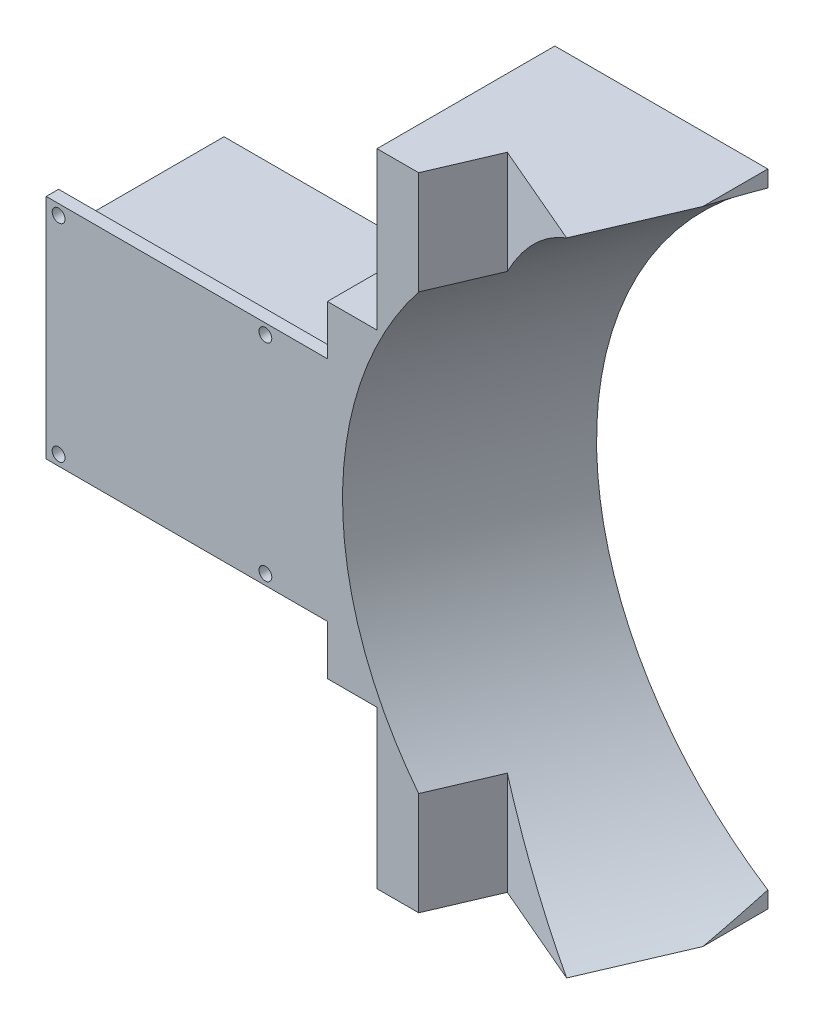
ISO-10303-21;
HEADER;
FILE_DESCRIPTION(('STEP AP214'),'2;1');
FILE_NAME('part.step','',(''),(''),'','','');
FILE_SCHEMA(('AUTOMOTIVE_DESIGN { 1 0 10303 214 1 1 1 1 }'));
ENDSEC;
DATA;
#1=APPLICATION_CONTEXT('core data for automotive mechanical design processes');
#2=APPLICATION_PROTOCOL_DEFINITION('international standard','automotive_design',2000,#1);
#3=PRODUCT_CONTEXT('',#1,'mechanical');
#4=PRODUCT('Part','Part','',(#3));
#5=PRODUCT_RELATED_PRODUCT_CATEGORY('part','',(#4));
#6=PRODUCT_DEFINITION_FORMATION('','',#4);
#7=PRODUCT_DEFINITION_CONTEXT('part definition',#1,'design');
#8=PRODUCT_DEFINITION('design','',#6,#7);
#9=PRODUCT_DEFINITION_SHAPE('','',#8);
#10=(LENGTH_UNIT() NAMED_UNIT(*) SI_UNIT(.MILLI.,.METRE.));
#11=(NAMED_UNIT(*) PLANE_ANGLE_UNIT() SI_UNIT($,.RADIAN.));
#12=(NAMED_UNIT(*) SI_UNIT($,.STERADIAN.) SOLID_ANGLE_UNIT());
#13=UNCERTAINTY_MEASURE_WITH_UNIT(LENGTH_MEASURE(1.E-05),#10,'distance_accuracy_value','');
#14=(GEOMETRIC_REPRESENTATION_CONTEXT(3) GLOBAL_UNCERTAINTY_ASSIGNED_CONTEXT((#13)) GLOBAL_UNIT_ASSIGNED_CONTEXT((#10,
#11,#12)) REPRESENTATION_CONTEXT('',''));
#15=CARTESIAN_POINT('',(0.,0.,0.));
#16=DIRECTION('',(0.,0.,1.));
#17=DIRECTION('',(1.,0.,0.));
#18=AXIS2_PLACEMENT_3D('',#15,#16,#17);
#19=CARTESIAN_POINT('',(0.,0.,0.));
#20=DIRECTION('',(0.,0.,1.));
#21=DIRECTION('',(1.,0.,0.));
#22=AXIS2_PLACEMENT_3D('',#19,#20,#21);
#23=PLANE('',#22);
#24=CARTESIAN_POINT('',(13.,25.,0.));
#25=DIRECTION('',(0.,0.,-1.));
#26=DIRECTION('',(-1.,0.,0.));
#27=AXIS2_PLACEMENT_3D('',#24,#25,#26);
#28=CIRCLE('',#27,1.55);
#29=CARTESIAN_POINT('',(11.45,25.,0.));
#30=VERTEX_POINT('',#29);
#31=EDGE_CURVE('E316',#30,#30,#28,.T.);
#32=ORIENTED_EDGE('',*,*,#31,.F.);
#33=EDGE_LOOP('',(#32));
#34=FACE_BOUND('',#33,.T.);
#35=CARTESIAN_POINT('',(-37.,25.,0.));
#36=DIRECTION('',(0.,0.,-1.));
#37=DIRECTION('',(-1.,0.,0.));
#38=AXIS2_PLACEMENT_3D('',#35,#36,#37);
#39=CIRCLE('',#38,1.55);
#40=CARTESIAN_POINT('',(-38.55,25.,0.));
#41=VERTEX_POINT('',#40);
#42=EDGE_CURVE('E321',#41,#41,#39,.T.);
#43=ORIENTED_EDGE('',*,*,#42,.F.);
#44=EDGE_LOOP('',(#43));
#45=FACE_BOUND('',#44,.T.);
#46=DIRECTION('',(1.,0.,0.));
#47=VECTOR('',#46,1.);
#48=CARTESIAN_POINT('',(-40.,18.5,0.));
#49=LINE('',#48,#47);
#50=CARTESIAN_POINT('',(-40.,18.5,0.));
#51=VERTEX_POINT('',#50);
#52=CARTESIAN_POINT('',(28.,18.5,0.));
#53=VERTEX_POINT('',#52);
#54=EDGE_CURVE('E60',#51,#53,#49,.T.);
#55=ORIENTED_EDGE('',*,*,#54,.F.);
#56=DIRECTION('',(0.,-1.,0.));
#57=VECTOR('',#56,1.);
#58=CARTESIAN_POINT('',(-40.,-27.5,0.));
#59=LINE('',#58,#57);
#60=CARTESIAN_POINT('',(-40.,27.5,0.));
#61=VERTEX_POINT('',#60);
#62=EDGE_CURVE('E209',#61,#51,#59,.T.);
#63=ORIENTED_EDGE('',*,*,#62,.F.);
#64=DIRECTION('',(-1.,0.,0.));
#65=VECTOR('',#64,1.);
#66=CARTESIAN_POINT('',(40.,27.5,0.));
#67=LINE('',#66,#65);
#68=CARTESIAN_POINT('',(28.,27.5,0.));
#69=VERTEX_POINT('',#68);
#70=EDGE_CURVE('E344',#69,#61,#67,.T.);
#71=ORIENTED_EDGE('',*,*,#70,.F.);
#72=DIRECTION('',(0.,1.,0.));
#73=VECTOR('',#72,1.);
#74=CARTESIAN_POINT('',(28.,27.5,0.));
#75=LINE('',#74,#73);
#76=EDGE_CURVE('E259',#53,#69,#75,.T.);
#77=ORIENTED_EDGE('',*,*,#76,.F.);
#78=EDGE_LOOP('',(#55,#63,#71,#77));
#79=FACE_BOUND('',#78,.T.);
#80=ADVANCED_FACE('F37',(#34,#45,#79),#23,.F.);
#81=CARTESIAN_POINT('',(-37.,-25.,0.));
#82=DIRECTION('',(0.,0.,-1.));
#83=DIRECTION('',(-1.,0.,0.));
#84=AXIS2_PLACEMENT_3D('',#81,#82,#83);
#85=CIRCLE('',#84,1.55);
#86=CARTESIAN_POINT('',(-38.55,-25.,0.));
#87=VERTEX_POINT('',#86);
#88=EDGE_CURVE('E317',#87,#87,#85,.T.);
#89=ORIENTED_EDGE('',*,*,#88,.F.);
#90=EDGE_LOOP('',(#89));
#91=FACE_BOUND('',#90,.T.);
#92=CARTESIAN_POINT('',(13.,-25.,0.));
#93=DIRECTION('',(0.,0.,-1.));
#94=DIRECTION('',(-1.,0.,0.));
#95=AXIS2_PLACEMENT_3D('',#92,#93,#94);
#96=CIRCLE('',#95,1.55);
#97=CARTESIAN_POINT('',(11.45,-25.,0.));
#98=VERTEX_POINT('',#97);
#99=EDGE_CURVE('E320',#98,#98,#96,.T.);
#100=ORIENTED_EDGE('',*,*,#99,.F.);
#101=EDGE_LOOP('',(#100));
#102=FACE_BOUND('',#101,.T.);
#103=DIRECTION('',(-1.,0.,0.));
#104=VECTOR('',#103,1.);
#105=CARTESIAN_POINT('',(-40.,-18.5,0.));
#106=LINE('',#105,#104);
#107=CARTESIAN_POINT('',(28.,-18.5,0.));
#108=VERTEX_POINT('',#107);
#109=CARTESIAN_POINT('',(-40.,-18.5,0.));
#110=VERTEX_POINT('',#109);
#111=EDGE_CURVE('E206',#108,#110,#106,.T.);
#112=ORIENTED_EDGE('',*,*,#111,.F.);
#113=CARTESIAN_POINT('',(28.,-27.5,0.));
#114=VERTEX_POINT('',#113);
#115=EDGE_CURVE('E260',#114,#108,#75,.T.);
#116=ORIENTED_EDGE('',*,*,#115,.F.);
#117=DIRECTION('',(1.,0.,0.));
#118=VECTOR('',#117,1.);
#119=CARTESIAN_POINT('',(40.,-27.5,0.));
#120=LINE('',#119,#118);
#121=CARTESIAN_POINT('',(-40.,-27.5,0.));
#122=VERTEX_POINT('',#121);
#123=EDGE_CURVE('E351',#122,#114,#120,.T.);
#124=ORIENTED_EDGE('',*,*,#123,.F.);
#125=EDGE_CURVE('E52',#110,#122,#59,.T.);
#126=ORIENTED_EDGE('',*,*,#125,.F.);
#127=EDGE_LOOP('',(#112,#116,#124,#126));
#128=FACE_BOUND('',#127,.T.);
#129=ADVANCED_FACE('F441',(#91,#102,#128),#23,.F.);
#130=CARTESIAN_POINT('',(28.,0.,0.));
#131=DIRECTION('',(-1.,0.,0.));
#132=DIRECTION('',(0.,0.,1.));
#133=AXIS2_PLACEMENT_3D('',#130,#131,#132);
#134=PLANE('',#133);
#135=DIRECTION('',(0.,-1.,0.));
#136=VECTOR('',#135,1.);
#137=CARTESIAN_POINT('',(28.,39.5,-40.));
#138=LINE('',#137,#136);
#139=CARTESIAN_POINT('',(28.,39.5,-40.));
#140=VERTEX_POINT('',#139);
#141=CARTESIAN_POINT('',(28.,18.5,-40.));
#142=VERTEX_POINT('',#141);
#143=EDGE_CURVE('E250',#140,#142,#138,.T.);
#144=ORIENTED_EDGE('',*,*,#143,.T.);
#145=DIRECTION('',(0.,0.,1.));
#146=VECTOR('',#145,1.);
#147=CARTESIAN_POINT('',(28.,18.5,-40.));
#148=LINE('',#147,#146);
#149=EDGE_CURVE('E193',#142,#53,#148,.T.);
#150=ORIENTED_EDGE('',*,*,#149,.T.);
#151=ORIENTED_EDGE('',*,*,#76,.T.);
#152=DIRECTION('',(0.,0.,1.));
#153=VECTOR('',#152,1.);
#154=CARTESIAN_POINT('',(28.,27.5,3.));
#155=LINE('',#154,#153);
#156=CARTESIAN_POINT('',(28.,27.5,3.));
#157=VERTEX_POINT('',#156);
#158=EDGE_CURVE('E263',#69,#157,#155,.T.);
#159=ORIENTED_EDGE('',*,*,#158,.T.);
#160=DIRECTION('',(0.,1.,0.));
#161=VECTOR('',#160,1.);
#162=CARTESIAN_POINT('',(28.,39.5,3.));
#163=LINE('',#162,#161);
#164=CARTESIAN_POINT('',(28.,39.5,3.));
#165=VERTEX_POINT('',#164);
#166=EDGE_CURVE('E265',#157,#165,#163,.T.);
#167=ORIENTED_EDGE('',*,*,#166,.T.);
#168=DIRECTION('',(0.,0.,-1.));
#169=VECTOR('',#168,1.);
#170=CARTESIAN_POINT('',(28.,39.5,-40.));
#171=LINE('',#170,#169);
#172=EDGE_CURVE('E267',#165,#140,#171,.T.);
#173=ORIENTED_EDGE('',*,*,#172,.T.);
#174=EDGE_LOOP('',(#144,#150,#151,#159,#167,#173));
#175=FACE_BOUND('',#174,.T.);
#176=ADVANCED_FACE('F424',(#175),#134,.T.);
#177=ORIENTED_EDGE('',*,*,#115,.T.);
#178=DIRECTION('',(0.,0.,1.));
#179=VECTOR('',#178,1.);
#180=CARTESIAN_POINT('',(28.,-18.5,-40.));
#181=LINE('',#180,#179);
#182=CARTESIAN_POINT('',(28.,-18.5,-40.));
#183=VERTEX_POINT('',#182);
#184=EDGE_CURVE('E216',#183,#108,#181,.T.);
#185=ORIENTED_EDGE('',*,*,#184,.F.);
#186=CARTESIAN_POINT('',(28.,-39.5,-40.));
#187=VERTEX_POINT('',#186);
#188=EDGE_CURVE('E253',#183,#187,#138,.T.);
#189=ORIENTED_EDGE('',*,*,#188,.T.);
#190=DIRECTION('',(0.,0.,1.));
#191=VECTOR('',#190,1.);
#192=CARTESIAN_POINT('',(28.,-39.5,-40.));
#193=LINE('',#192,#191);
#194=CARTESIAN_POINT('',(28.,-39.5,3.));
#195=VERTEX_POINT('',#194);
#196=EDGE_CURVE('E252',#187,#195,#193,.T.);
#197=ORIENTED_EDGE('',*,*,#196,.T.);
#198=DIRECTION('',(0.,1.,0.));
#199=VECTOR('',#198,1.);
#200=CARTESIAN_POINT('',(28.,-27.5,3.));
#201=LINE('',#200,#199);
#202=CARTESIAN_POINT('',(28.,-27.5,3.));
#203=VERTEX_POINT('',#202);
#204=EDGE_CURVE('E255',#195,#203,#201,.T.);
#205=ORIENTED_EDGE('',*,*,#204,.T.);
#206=DIRECTION('',(0.,0.,-1.));
#207=VECTOR('',#206,1.);
#208=CARTESIAN_POINT('',(28.,-27.5,0.));
#209=LINE('',#208,#207);
#210=EDGE_CURVE('E257',#203,#114,#209,.T.);
#211=ORIENTED_EDGE('',*,*,#210,.T.);
#212=EDGE_LOOP('',(#177,#185,#189,#197,#205,#211));
#213=FACE_BOUND('',#212,.T.);
#214=ADVANCED_FACE('F438',(#213),#134,.T.);
#215=CARTESIAN_POINT('',(0.,77.5,0.));
#216=DIRECTION('',(0.,1.,0.));
#217=DIRECTION('',(0.,0.,1.));
#218=AXIS2_PLACEMENT_3D('',#215,#216,#217);
#219=PLANE('',#218);
#220=DIRECTION('',(0.919145030018058,0.,0.393919298579168));
#221=VECTOR('',#220,1.);
#222=CARTESIAN_POINT('',(56.5,77.5,-12.));
#223=LINE('',#222,#221);
#224=CARTESIAN_POINT('',(56.5,77.5,-12.));
#225=VERTEX_POINT('',#224);
#226=CARTESIAN_POINT('',(81.6122853499701,77.5,-1.23759199286999));
#227=VERTEX_POINT('',#226);
#228=EDGE_CURVE('E235',#225,#227,#223,.T.);
#229=ORIENTED_EDGE('',*,*,#228,.T.);
#230=DIRECTION('',(0.393919298579168,0.,-0.919145030018058));
#231=VECTOR('',#230,1.);
#232=CARTESIAN_POINT('',(45.3717098806866,77.5,83.3237507687914));
#233=LINE('',#232,#231);
#234=CARTESIAN_POINT('',(91.5,77.5,-24.3089261762733));
#235=VERTEX_POINT('',#234);
#236=EDGE_CURVE('E228',#227,#235,#233,.T.);
#237=ORIENTED_EDGE('',*,*,#236,.T.);
#238=DIRECTION('',(0.,0.,-1.));
#239=VECTOR('',#238,1.);
#240=CARTESIAN_POINT('',(91.5,77.5,0.));
#241=LINE('',#240,#239);
#242=CARTESIAN_POINT('',(91.5,77.5,-40.));
#243=VERTEX_POINT('',#242);
#244=EDGE_CURVE('E311',#235,#243,#241,.T.);
#245=ORIENTED_EDGE('',*,*,#244,.T.);
#246=DIRECTION('',(1.,0.,0.));
#247=VECTOR('',#246,1.);
#248=CARTESIAN_POINT('',(91.5,77.5,-40.));
#249=LINE('',#248,#247);
#250=CARTESIAN_POINT('',(40.,77.5,-40.));
#251=VERTEX_POINT('',#250);
#252=EDGE_CURVE('E292',#251,#243,#249,.T.);
#253=ORIENTED_EDGE('',*,*,#252,.F.);
#254=DIRECTION('',(0.,0.,1.));
#255=VECTOR('',#254,1.);
#256=CARTESIAN_POINT('',(40.,77.5,0.));
#257=LINE('',#256,#255);
#258=CARTESIAN_POINT('',(40.,77.5,3.));
#259=VERTEX_POINT('',#258);
#260=EDGE_CURVE('E305',#251,#259,#257,.T.);
#261=ORIENTED_EDGE('',*,*,#260,.T.);
#262=DIRECTION('',(1.,0.,0.));
#263=VECTOR('',#262,1.);
#264=CARTESIAN_POINT('',(40.,77.5,3.));
#265=LINE('',#264,#263);
#266=CARTESIAN_POINT('',(50.0714285714286,77.5,3.));
#267=VERTEX_POINT('',#266);
#268=EDGE_CURVE('E308',#259,#267,#265,.T.);
#269=ORIENTED_EDGE('',*,*,#268,.T.);
#270=DIRECTION('',(-0.393919298579168,0.,0.919145030018058));
#271=VECTOR('',#270,1.);
#272=CARTESIAN_POINT('',(56.5,77.5,-12.));
#273=LINE('',#272,#271);
#274=EDGE_CURVE('E238',#225,#267,#273,.T.);
#275=ORIENTED_EDGE('',*,*,#274,.F.);
#276=EDGE_LOOP('',(#229,#237,#245,#253,#261,#269,#275));
#277=FACE_BOUND('',#276,.T.);
#278=ADVANCED_FACE('F402',(#277),#219,.T.);
#279=CARTESIAN_POINT('',(0.,-77.5,0.));
#280=DIRECTION('',(0.,-1.,0.));
#281=DIRECTION('',(1.,0.,0.));
#282=AXIS2_PLACEMENT_3D('',#279,#280,#281);
#283=PLANE('',#282);
#284=DIRECTION('',(0.,0.,1.));
#285=VECTOR('',#284,1.);
#286=CARTESIAN_POINT('',(91.5,-77.5,3.));
#287=LINE('',#286,#285);
#288=CARTESIAN_POINT('',(91.5,-77.5,-40.));
#289=VERTEX_POINT('',#288);
#290=CARTESIAN_POINT('',(91.5,-77.5,-24.3089261762733));
#291=VERTEX_POINT('',#290);
#292=EDGE_CURVE('E297',#289,#291,#287,.T.);
#293=ORIENTED_EDGE('',*,*,#292,.T.);
#294=DIRECTION('',(0.393919298579168,0.,-0.919145030018058));
#295=VECTOR('',#294,1.);
#296=CARTESIAN_POINT('',(45.3717098806866,-77.5,83.3237507687914));
#297=LINE('',#296,#295);
#298=CARTESIAN_POINT('',(81.61228534997,-77.5,-1.23759199287));
#299=VERTEX_POINT('',#298);
#300=EDGE_CURVE('E222',#291,#299,#297,.F.);
#301=ORIENTED_EDGE('',*,*,#300,.T.);
#302=DIRECTION('',(-0.919145030018058,0.,-0.393919298579168));
#303=VECTOR('',#302,1.);
#304=CARTESIAN_POINT('',(13.1120689655172,-77.5,-30.5948275862069));
#305=LINE('',#304,#303);
#306=CARTESIAN_POINT('',(56.5,-77.5,-12.));
#307=VERTEX_POINT('',#306);
#308=EDGE_CURVE('E362',#299,#307,#305,.T.);
#309=ORIENTED_EDGE('',*,*,#308,.T.);
#310=DIRECTION('',(0.393919298579168,0.,-0.919145030018058));
#311=VECTOR('',#310,1.);
#312=CARTESIAN_POINT('',(43.3879310344828,-77.5,18.5948275862069));
#313=LINE('',#312,#311);
#314=CARTESIAN_POINT('',(50.0714285714286,-77.5,3.));
#315=VERTEX_POINT('',#314);
#316=EDGE_CURVE('E359',#315,#307,#313,.T.);
#317=ORIENTED_EDGE('',*,*,#316,.F.);
#318=DIRECTION('',(-1.,0.,0.));
#319=VECTOR('',#318,1.);
#320=CARTESIAN_POINT('',(40.,-77.5,3.));
#321=LINE('',#320,#319);
#322=CARTESIAN_POINT('',(40.,-77.5,3.));
#323=VERTEX_POINT('',#322);
#324=EDGE_CURVE('E300',#315,#323,#321,.T.);
#325=ORIENTED_EDGE('',*,*,#324,.T.);
#326=DIRECTION('',(0.,0.,-1.));
#327=VECTOR('',#326,1.);
#328=CARTESIAN_POINT('',(40.,-77.5,3.));
#329=LINE('',#328,#327);
#330=CARTESIAN_POINT('',(40.,-77.5,-40.));
#331=VERTEX_POINT('',#330);
#332=EDGE_CURVE('E295',#323,#331,#329,.T.);
#333=ORIENTED_EDGE('',*,*,#332,.T.);
#334=DIRECTION('',(-1.,0.,0.));
#335=VECTOR('',#334,1.);
#336=CARTESIAN_POINT('',(91.5,-77.5,-40.));
#337=LINE('',#336,#335);
#338=EDGE_CURVE('E285',#289,#331,#337,.T.);
#339=ORIENTED_EDGE('',*,*,#338,.F.);
#340=EDGE_LOOP('',(#293,#301,#309,#317,#325,#333,#339));
#341=FACE_BOUND('',#340,.T.);
#342=ADVANCED_FACE('F375',(#341),#283,.T.);
#343=CARTESIAN_POINT('',(91.5,0.,0.));
#344=DIRECTION('',(1.,0.,0.));
#345=DIRECTION('',(0.,0.,-1.));
#346=AXIS2_PLACEMENT_3D('',#343,#344,#345);
#347=PLANE('',#346);
#348=DIRECTION('',(0.,-1.,0.));
#349=VECTOR('',#348,1.);
#350=CARTESIAN_POINT('',(91.5,77.5,-40.));
#351=LINE('',#350,#349);
#352=CARTESIAN_POINT('',(91.5,-73.5009463760383,-40.));
#353=VERTEX_POINT('',#352);
#354=EDGE_CURVE('E282',#353,#289,#351,.T.);
#355=ORIENTED_EDGE('',*,*,#354,.F.);
#356=CARTESIAN_POINT('',(91.5,0.,91.850686235079));
#357=DIRECTION('',(1.,0.,0.));
#358=DIRECTION('',(0.,0.,-1.));
#359=AXIS2_PLACEMENT_3D('',#356,#357,#358);
#360=ELLIPSE('',#359,228.473193175917,90.);
#361=EDGE_CURVE('E225',#353,#291,#360,.F.);
#362=ORIENTED_EDGE('',*,*,#361,.T.);
#363=ORIENTED_EDGE('',*,*,#292,.F.);
#364=EDGE_LOOP('',(#355,#362,#363));
#365=FACE_BOUND('',#364,.T.);
#366=ADVANCED_FACE('F392',(#365),#347,.T.);
#367=CARTESIAN_POINT('',(56.5,-106.5,-12.));
#368=DIRECTION('',(-0.393919298579168,0.,0.919145030018058));
#369=DIRECTION('',(0.919145030018058,0.,0.393919298579168));
#370=AXIS2_PLACEMENT_3D('',#367,#368,#369);
#371=PLANE('',#370);
#372=ORIENTED_EDGE('',*,*,#308,.F.);
#373=CARTESIAN_POINT('',(123.670076050632,0.,16.7871754502709));
#374=DIRECTION('',(-0.393919298579168,0.,0.919145030018058));
#375=DIRECTION('',(0.919145030018058,0.,0.393919298579168));
#376=AXIS2_PLACEMENT_3D('',#373,#374,#375);
#377=CIRCLE('',#376,90.);
#378=CARTESIAN_POINT('',(56.5,-52.5307473100053,-12.));
#379=VERTEX_POINT('',#378);
#380=EDGE_CURVE('E210',#299,#379,#377,.F.);
#381=ORIENTED_EDGE('',*,*,#380,.T.);
#382=DIRECTION('',(0.,1.,0.));
#383=VECTOR('',#382,1.);
#384=CARTESIAN_POINT('',(56.5,-106.5,-12.));
#385=LINE('',#384,#383);
#386=EDGE_CURVE('E242',#307,#379,#385,.T.);
#387=ORIENTED_EDGE('',*,*,#386,.F.);
#388=EDGE_LOOP('',(#372,#381,#387));
#389=FACE_BOUND('',#388,.T.);
#390=ADVANCED_FACE('F370',(#389),#371,.T.);
#391=CARTESIAN_POINT('',(56.5,-106.5,-12.));
#392=DIRECTION('',(-0.919145030018058,0.,-0.393919298579168));
#393=DIRECTION('',(-0.393919298579168,0.,0.919145030018058));
#394=AXIS2_PLACEMENT_3D('',#391,#392,#393);
#395=PLANE('',#394);
#396=DIRECTION('',(0.393919298579168,0.,-0.919145030018058));
#397=VECTOR('',#396,1.);
#398=CARTESIAN_POINT('',(20.2594245307166,52.5307473100053,72.5613427616614));
#399=LINE('',#398,#397);
#400=CARTESIAN_POINT('',(56.5,52.5307473100053,-12.));
#401=VERTEX_POINT('',#400);
#402=CARTESIAN_POINT('',(50.0714285714286,52.5307473100054,3.));
#403=VERTEX_POINT('',#402);
#404=EDGE_CURVE('E11',#401,#403,#399,.F.);
#405=ORIENTED_EDGE('',*,*,#404,.F.);
#406=EDGE_CURVE('E241',#401,#225,#385,.T.);
#407=ORIENTED_EDGE('',*,*,#406,.T.);
#408=ORIENTED_EDGE('',*,*,#274,.T.);
#409=DIRECTION('',(0.,1.,0.));
#410=VECTOR('',#409,1.);
#411=CARTESIAN_POINT('',(50.0714285714286,-106.5,3.));
#412=LINE('',#411,#410);
#413=EDGE_CURVE('E245',#403,#267,#412,.T.);
#414=ORIENTED_EDGE('',*,*,#413,.F.);
#415=EDGE_LOOP('',(#405,#407,#408,#414));
#416=FACE_BOUND('',#415,.T.);
#417=ADVANCED_FACE('F412',(#416),#395,.F.);
#418=DIRECTION('',(0.393919298579168,0.,-0.919145030018058));
#419=VECTOR('',#418,1.);
#420=CARTESIAN_POINT('',(20.2594245307166,-52.5307473100053,72.5613427616614));
#421=LINE('',#420,#419);
#422=CARTESIAN_POINT('',(50.0714285714286,-52.5307473100053,3.));
#423=VERTEX_POINT('',#422);
#424=EDGE_CURVE('E45',#423,#379,#421,.T.);
#425=ORIENTED_EDGE('',*,*,#424,.F.);
#426=EDGE_CURVE('E246',#315,#423,#412,.T.);
#427=ORIENTED_EDGE('',*,*,#426,.F.);
#428=ORIENTED_EDGE('',*,*,#316,.T.);
#429=ORIENTED_EDGE('',*,*,#386,.T.);
#430=EDGE_LOOP('',(#425,#427,#428,#429));
#431=FACE_BOUND('',#430,.T.);
#432=ADVANCED_FACE('F371',(#431),#395,.F.);
#433=CARTESIAN_POINT('',(40.,77.5,0.));
#434=DIRECTION('',(1.,0.,0.));
#435=DIRECTION('',(0.,0.,-1.));
#436=AXIS2_PLACEMENT_3D('',#433,#434,#435);
#437=PLANE('',#436);
#438=DIRECTION('',(0.,0.,1.));
#439=VECTOR('',#438,1.);
#440=CARTESIAN_POINT('',(40.,-39.5,-40.));
#441=LINE('',#440,#439);
#442=CARTESIAN_POINT('',(40.,-39.5,-40.));
#443=VERTEX_POINT('',#442);
#444=CARTESIAN_POINT('',(40.,-39.5,3.));
#445=VERTEX_POINT('',#444);
#446=EDGE_CURVE('E249',#443,#445,#441,.T.);
#447=ORIENTED_EDGE('',*,*,#446,.F.);
#448=DIRECTION('',(0.,1.,0.));
#449=VECTOR('',#448,1.);
#450=CARTESIAN_POINT('',(40.,77.5,-40.));
#451=LINE('',#450,#449);
#452=EDGE_CURVE('E289',#331,#443,#451,.T.);
#453=ORIENTED_EDGE('',*,*,#452,.F.);
#454=ORIENTED_EDGE('',*,*,#332,.F.);
#455=DIRECTION('',(0.,1.,0.));
#456=VECTOR('',#455,1.);
#457=CARTESIAN_POINT('',(40.,-77.5,3.));
#458=LINE('',#457,#456);
#459=EDGE_CURVE('E302',#323,#445,#458,.T.);
#460=ORIENTED_EDGE('',*,*,#459,.T.);
#461=EDGE_LOOP('',(#447,#453,#454,#460));
#462=FACE_BOUND('',#461,.T.);
#463=ADVANCED_FACE('F386',(#462),#437,.F.);
#464=DIRECTION('',(0.,0.,-1.));
#465=VECTOR('',#464,1.);
#466=CARTESIAN_POINT('',(40.,39.5,-40.));
#467=LINE('',#466,#465);
#468=CARTESIAN_POINT('',(40.,39.5,3.));
#469=VERTEX_POINT('',#468);
#470=CARTESIAN_POINT('',(40.,39.5,-40.));
#471=VERTEX_POINT('',#470);
#472=EDGE_CURVE('E271',#469,#471,#467,.T.);
#473=ORIENTED_EDGE('',*,*,#472,.F.);
#474=DIRECTION('',(0.,-1.,0.));
#475=VECTOR('',#474,1.);
#476=CARTESIAN_POINT('',(40.,77.5,3.));
#477=LINE('',#476,#475);
#478=EDGE_CURVE('E313',#259,#469,#477,.T.);
#479=ORIENTED_EDGE('',*,*,#478,.F.);
#480=ORIENTED_EDGE('',*,*,#260,.F.);
#481=EDGE_CURVE('E288',#471,#251,#451,.T.);
#482=ORIENTED_EDGE('',*,*,#481,.F.);
#483=EDGE_LOOP('',(#473,#479,#480,#482));
#484=FACE_BOUND('',#483,.T.);
#485=ADVANCED_FACE('F419',(#484),#437,.F.);
#486=CARTESIAN_POINT('',(40.,-27.5,3.));
#487=DIRECTION('',(0.,1.,0.));
#488=DIRECTION('',(-1.,0.,0.));
#489=AXIS2_PLACEMENT_3D('',#486,#487,#488);
#490=PLANE('',#489);
#491=ORIENTED_EDGE('',*,*,#123,.T.);
#492=ORIENTED_EDGE('',*,*,#210,.F.);
#493=DIRECTION('',(1.,0.,0.));
#494=VECTOR('',#493,1.);
#495=CARTESIAN_POINT('',(40.,-27.5,3.));
#496=LINE('',#495,#494);
#497=CARTESIAN_POINT('',(-40.,-27.5,3.));
#498=VERTEX_POINT('',#497);
#499=EDGE_CURVE('E343',#498,#203,#496,.T.);
#500=ORIENTED_EDGE('',*,*,#499,.F.);
#501=DIRECTION('',(0.,0.,-1.));
#502=VECTOR('',#501,1.);
#503=CARTESIAN_POINT('',(-40.,-27.5,3.));
#504=LINE('',#503,#502);
#505=EDGE_CURVE('E356',#498,#122,#504,.T.);
#506=ORIENTED_EDGE('',*,*,#505,.T.);
#507=EDGE_LOOP('',(#491,#492,#500,#506));
#508=FACE_BOUND('',#507,.T.);
#509=ADVANCED_FACE('F435',(#508),#490,.F.);
#510=CARTESIAN_POINT('',(40.,27.5,3.));
#511=DIRECTION('',(0.,-1.,0.));
#512=DIRECTION('',(1.,0.,0.));
#513=AXIS2_PLACEMENT_3D('',#510,#511,#512);
#514=PLANE('',#513);
#515=DIRECTION('',(-1.,0.,0.));
#516=VECTOR('',#515,1.);
#517=CARTESIAN_POINT('',(40.,27.5,3.));
#518=LINE('',#517,#516);
#519=CARTESIAN_POINT('',(-40.,27.5,3.));
#520=VERTEX_POINT('',#519);
#521=EDGE_CURVE('E347',#157,#520,#518,.T.);
#522=ORIENTED_EDGE('',*,*,#521,.F.);
#523=ORIENTED_EDGE('',*,*,#158,.F.);
#524=ORIENTED_EDGE('',*,*,#70,.T.);
#525=DIRECTION('',(0.,0.,-1.));
#526=VECTOR('',#525,1.);
#527=CARTESIAN_POINT('',(-40.,27.5,3.));
#528=LINE('',#527,#526);
#529=EDGE_CURVE('E349',#520,#61,#528,.T.);
#530=ORIENTED_EDGE('',*,*,#529,.F.);
#531=EDGE_LOOP('',(#522,#523,#524,#530));
#532=FACE_BOUND('',#531,.T.);
#533=ADVANCED_FACE('F429',(#532),#514,.F.);
#534=CARTESIAN_POINT('',(-40.,-27.5,3.));
#535=DIRECTION('',(1.,0.,0.));
#536=DIRECTION('',(0.,0.,-1.));
#537=AXIS2_PLACEMENT_3D('',#534,#535,#536);
#538=PLANE('',#537);
#539=ORIENTED_EDGE('',*,*,#62,.T.);
#540=DIRECTION('',(0.,0.,1.));
#541=VECTOR('',#540,1.);
#542=CARTESIAN_POINT('',(-40.,18.5,-40.));
#543=LINE('',#542,#541);
#544=CARTESIAN_POINT('',(-40.,18.5,-40.));
#545=VERTEX_POINT('',#544);
#546=EDGE_CURVE('E192',#545,#51,#543,.T.);
#547=ORIENTED_EDGE('',*,*,#546,.F.);
#548=DIRECTION('',(0.,1.,0.));
#549=VECTOR('',#548,1.);
#550=CARTESIAN_POINT('',(-40.,18.5,-40.));
#551=LINE('',#550,#549);
#552=CARTESIAN_POINT('',(-40.,-18.5,-40.));
#553=VERTEX_POINT('',#552);
#554=EDGE_CURVE('E197',#553,#545,#551,.T.);
#555=ORIENTED_EDGE('',*,*,#554,.F.);
#556=DIRECTION('',(0.,0.,1.));
#557=VECTOR('',#556,1.);
#558=CARTESIAN_POINT('',(-40.,-18.5,-40.));
#559=LINE('',#558,#557);
#560=EDGE_CURVE('E447',#553,#110,#559,.T.);
#561=ORIENTED_EDGE('',*,*,#560,.T.);
#562=ORIENTED_EDGE('',*,*,#125,.T.);
#563=ORIENTED_EDGE('',*,*,#505,.F.);
#564=DIRECTION('',(0.,-1.,0.));
#565=VECTOR('',#564,1.);
#566=CARTESIAN_POINT('',(-40.,-27.5,3.));
#567=LINE('',#566,#565);
#568=EDGE_CURVE('E340',#520,#498,#567,.T.);
#569=ORIENTED_EDGE('',*,*,#568,.F.);
#570=ORIENTED_EDGE('',*,*,#529,.T.);
#571=EDGE_LOOP('',(#539,#547,#555,#561,#562,#563,#569,#570));
#572=FACE_BOUND('',#571,.T.);
#573=ADVANCED_FACE('F39',(#572),#538,.F.);
#574=CARTESIAN_POINT('',(0.,0.,3.));
#575=DIRECTION('',(0.,0.,1.));
#576=DIRECTION('',(1.,0.,0.));
#577=AXIS2_PLACEMENT_3D('',#574,#575,#576);
#578=PLANE('',#577);
#579=ORIENTED_EDGE('',*,*,#426,.T.);
#580=CARTESIAN_POINT('',(129.57886552932,0.,3.));
#581=DIRECTION('',(0.,0.,1.));
#582=DIRECTION('',(1.,0.,0.));
#583=AXIS2_PLACEMENT_3D('',#580,#581,#582);
#584=ELLIPSE('',#583,97.9170827896789,90.);
#585=EDGE_CURVE('E213',#423,#403,#584,.F.);
#586=ORIENTED_EDGE('',*,*,#585,.T.);
#587=ORIENTED_EDGE('',*,*,#413,.T.);
#588=ORIENTED_EDGE('',*,*,#268,.F.);
#589=ORIENTED_EDGE('',*,*,#478,.T.);
#590=DIRECTION('',(1.,0.,0.));
#591=VECTOR('',#590,1.);
#592=CARTESIAN_POINT('',(28.,39.5,3.));
#593=LINE('',#592,#591);
#594=EDGE_CURVE('E275',#165,#469,#593,.T.);
#595=ORIENTED_EDGE('',*,*,#594,.F.);
#596=ORIENTED_EDGE('',*,*,#166,.F.);
#597=ORIENTED_EDGE('',*,*,#521,.T.);
#598=ORIENTED_EDGE('',*,*,#568,.T.);
#599=ORIENTED_EDGE('',*,*,#499,.T.);
#600=ORIENTED_EDGE('',*,*,#204,.F.);
#601=DIRECTION('',(1.,0.,0.));
#602=VECTOR('',#601,1.);
#603=CARTESIAN_POINT('',(28.,-39.5,3.));
#604=LINE('',#603,#602);
#605=EDGE_CURVE('E277',#195,#445,#604,.T.);
#606=ORIENTED_EDGE('',*,*,#605,.T.);
#607=ORIENTED_EDGE('',*,*,#459,.F.);
#608=ORIENTED_EDGE('',*,*,#324,.F.);
#609=EDGE_LOOP('',(#579,#586,#587,#588,#589,#595,#596,#597,#598,#599,#600,#606,#607,#608));
#610=FACE_BOUND('',#609,.T.);
#611=CARTESIAN_POINT('',(13.,25.,3.));
#612=DIRECTION('',(0.,0.,1.));
#613=DIRECTION('',(1.,0.,0.));
#614=AXIS2_PLACEMENT_3D('',#611,#612,#613);
#615=CIRCLE('',#614,1.55);
#616=CARTESIAN_POINT('',(14.55,25.,3.));
#617=VERTEX_POINT('',#616);
#618=EDGE_CURVE('E337',#617,#617,#615,.T.);
#619=ORIENTED_EDGE('',*,*,#618,.F.);
#620=EDGE_LOOP('',(#619));
#621=FACE_BOUND('',#620,.T.);
#622=CARTESIAN_POINT('',(-37.,25.,3.));
#623=DIRECTION('',(0.,0.,1.));
#624=DIRECTION('',(1.,0.,0.));
#625=AXIS2_PLACEMENT_3D('',#622,#623,#624);
#626=CIRCLE('',#625,1.55);
#627=CARTESIAN_POINT('',(-35.45,25.,3.));
#628=VERTEX_POINT('',#627);
#629=EDGE_CURVE('E334',#628,#628,#626,.T.);
#630=ORIENTED_EDGE('',*,*,#629,.F.);
#631=EDGE_LOOP('',(#630));
#632=FACE_BOUND('',#631,.T.);
#633=CARTESIAN_POINT('',(-37.,-25.,3.));
#634=DIRECTION('',(0.,0.,1.));
#635=DIRECTION('',(1.,0.,0.));
#636=AXIS2_PLACEMENT_3D('',#633,#634,#635);
#637=CIRCLE('',#636,1.55);
#638=CARTESIAN_POINT('',(-35.45,-25.,3.));
#639=VERTEX_POINT('',#638);
#640=EDGE_CURVE('E331',#639,#639,#637,.T.);
#641=ORIENTED_EDGE('',*,*,#640,.F.);
#642=EDGE_LOOP('',(#641));
#643=FACE_BOUND('',#642,.T.);
#644=CARTESIAN_POINT('',(13.,-25.,3.));
#645=DIRECTION('',(0.,0.,1.));
#646=DIRECTION('',(1.,0.,0.));
#647=AXIS2_PLACEMENT_3D('',#644,#645,#646);
#648=CIRCLE('',#647,1.55);
#649=CARTESIAN_POINT('',(14.55,-25.,3.));
#650=VERTEX_POINT('',#649);
#651=EDGE_CURVE('E328',#650,#650,#648,.T.);
#652=ORIENTED_EDGE('',*,*,#651,.F.);
#653=EDGE_LOOP('',(#652));
#654=FACE_BOUND('',#653,.T.);
#655=ADVANCED_FACE('F378',(#610,#621,#632,#643,#654),#578,.T.);
#656=CARTESIAN_POINT('',(13.,-25.,24.5));
#657=DIRECTION('',(0.,0.,-1.));
#658=DIRECTION('',(-1.,0.,0.));
#659=AXIS2_PLACEMENT_3D('',#656,#657,#658);
#660=CYLINDRICAL_SURFACE('',#659,1.55);
#661=ORIENTED_EDGE('',*,*,#651,.T.);
#662=EDGE_LOOP('',(#661));
#663=FACE_BOUND('',#662,.T.);
#664=ORIENTED_EDGE('',*,*,#99,.T.);
#665=EDGE_LOOP('',(#664));
#666=FACE_BOUND('',#665,.T.);
#667=ADVANCED_FACE('F493',(#663,#666),#660,.F.);
#668=CARTESIAN_POINT('',(-37.,-25.,24.5));
#669=DIRECTION('',(0.,0.,-1.));
#670=DIRECTION('',(-1.,0.,0.));
#671=AXIS2_PLACEMENT_3D('',#668,#669,#670);
#672=CYLINDRICAL_SURFACE('',#671,1.55);
#673=ORIENTED_EDGE('',*,*,#640,.T.);
#674=EDGE_LOOP('',(#673));
#675=FACE_BOUND('',#674,.T.);
#676=ORIENTED_EDGE('',*,*,#88,.T.);
#677=EDGE_LOOP('',(#676));
#678=FACE_BOUND('',#677,.T.);
#679=ADVANCED_FACE('F489',(#675,#678),#672,.F.);
#680=CARTESIAN_POINT('',(-37.,25.,24.5));
#681=DIRECTION('',(0.,0.,-1.));
#682=DIRECTION('',(-1.,0.,0.));
#683=AXIS2_PLACEMENT_3D('',#680,#681,#682);
#684=CYLINDRICAL_SURFACE('',#683,1.55);
#685=ORIENTED_EDGE('',*,*,#629,.T.);
#686=EDGE_LOOP('',(#685));
#687=FACE_BOUND('',#686,.T.);
#688=ORIENTED_EDGE('',*,*,#42,.T.);
#689=EDGE_LOOP('',(#688));
#690=FACE_BOUND('',#689,.T.);
#691=ADVANCED_FACE('F492',(#687,#690),#684,.F.);
#692=CARTESIAN_POINT('',(13.,25.,24.5));
#693=DIRECTION('',(0.,0.,-1.));
#694=DIRECTION('',(-1.,0.,0.));
#695=AXIS2_PLACEMENT_3D('',#692,#693,#694);
#696=CYLINDRICAL_SURFACE('',#695,1.55);
#697=ORIENTED_EDGE('',*,*,#618,.T.);
#698=EDGE_LOOP('',(#697));
#699=FACE_BOUND('',#698,.T.);
#700=ORIENTED_EDGE('',*,*,#31,.T.);
#701=EDGE_LOOP('',(#700));
#702=FACE_BOUND('',#701,.T.);
#703=ADVANCED_FACE('F488',(#699,#702),#696,.F.);
#704=ORIENTED_EDGE('',*,*,#244,.F.);
#705=CARTESIAN_POINT('',(91.5,73.5009463760383,-40.));
#706=VERTEX_POINT('',#705);
#707=EDGE_CURVE('E229',#235,#706,#360,.F.);
#708=ORIENTED_EDGE('',*,*,#707,.T.);
#709=EDGE_CURVE('E283',#243,#706,#351,.T.);
#710=ORIENTED_EDGE('',*,*,#709,.F.);
#711=EDGE_LOOP('',(#704,#708,#710));
#712=FACE_BOUND('',#711,.T.);
#713=ADVANCED_FACE('F397',(#712),#347,.T.);
#714=CARTESIAN_POINT('',(0.,0.,-40.));
#715=DIRECTION('',(0.,0.,-1.));
#716=DIRECTION('',(-1.,0.,0.));
#717=AXIS2_PLACEMENT_3D('',#714,#715,#716);
#718=PLANE('',#717);
#719=ORIENTED_EDGE('',*,*,#709,.T.);
#720=CARTESIAN_POINT('',(148.007436957891,0.,-40.));
#721=DIRECTION('',(0.,0.,-1.));
#722=DIRECTION('',(1.,0.,0.));
#723=AXIS2_PLACEMENT_3D('',#720,#721,#722);
#724=ELLIPSE('',#723,97.9170827896789,90.);
#725=EDGE_CURVE('E232',#706,#353,#724,.F.);
#726=ORIENTED_EDGE('',*,*,#725,.T.);
#727=ORIENTED_EDGE('',*,*,#354,.T.);
#728=ORIENTED_EDGE('',*,*,#338,.T.);
#729=ORIENTED_EDGE('',*,*,#452,.T.);
#730=DIRECTION('',(1.,0.,0.));
#731=VECTOR('',#730,1.);
#732=CARTESIAN_POINT('',(28.,-39.5,-40.));
#733=LINE('',#732,#731);
#734=EDGE_CURVE('E280',#187,#443,#733,.T.);
#735=ORIENTED_EDGE('',*,*,#734,.F.);
#736=ORIENTED_EDGE('',*,*,#188,.F.);
#737=DIRECTION('',(-1.,0.,0.));
#738=VECTOR('',#737,1.);
#739=CARTESIAN_POINT('',(-40.,-18.5,-40.));
#740=LINE('',#739,#738);
#741=EDGE_CURVE('E196',#183,#553,#740,.T.);
#742=ORIENTED_EDGE('',*,*,#741,.T.);
#743=ORIENTED_EDGE('',*,*,#554,.T.);
#744=DIRECTION('',(1.,0.,0.));
#745=VECTOR('',#744,1.);
#746=CARTESIAN_POINT('',(-40.,18.5,-40.));
#747=LINE('',#746,#745);
#748=EDGE_CURVE('E188',#545,#142,#747,.T.);
#749=ORIENTED_EDGE('',*,*,#748,.T.);
#750=ORIENTED_EDGE('',*,*,#143,.F.);
#751=DIRECTION('',(1.,0.,0.));
#752=VECTOR('',#751,1.);
#753=CARTESIAN_POINT('',(28.,39.5,-40.));
#754=LINE('',#753,#752);
#755=EDGE_CURVE('E269',#140,#471,#754,.T.);
#756=ORIENTED_EDGE('',*,*,#755,.T.);
#757=ORIENTED_EDGE('',*,*,#481,.T.);
#758=ORIENTED_EDGE('',*,*,#252,.T.);
#759=EDGE_LOOP('',(#719,#726,#727,#728,#729,#735,#736,#742,#743,#749,#750,#756,#757,#758));
#760=FACE_BOUND('',#759,.T.);
#761=ADVANCED_FACE('F201',(#760),#718,.T.);
#762=CARTESIAN_POINT('',(28.,-39.5,-40.));
#763=DIRECTION('',(0.,1.,0.));
#764=DIRECTION('',(0.,0.,1.));
#765=AXIS2_PLACEMENT_3D('',#762,#763,#764);
#766=PLANE('',#765);
#767=ORIENTED_EDGE('',*,*,#446,.T.);
#768=ORIENTED_EDGE('',*,*,#605,.F.);
#769=ORIENTED_EDGE('',*,*,#196,.F.);
#770=ORIENTED_EDGE('',*,*,#734,.T.);
#771=EDGE_LOOP('',(#767,#768,#769,#770));
#772=FACE_BOUND('',#771,.T.);
#773=ADVANCED_FACE('F451',(#772),#766,.F.);
#774=CARTESIAN_POINT('',(28.,39.5,-40.));
#775=DIRECTION('',(0.,-1.,0.));
#776=DIRECTION('',(0.,0.,-1.));
#777=AXIS2_PLACEMENT_3D('',#774,#775,#776);
#778=PLANE('',#777);
#779=ORIENTED_EDGE('',*,*,#472,.T.);
#780=ORIENTED_EDGE('',*,*,#755,.F.);
#781=ORIENTED_EDGE('',*,*,#172,.F.);
#782=ORIENTED_EDGE('',*,*,#594,.T.);
#783=EDGE_LOOP('',(#779,#780,#781,#782));
#784=FACE_BOUND('',#783,.T.);
#785=ADVANCED_FACE('F422',(#784),#778,.F.);
#786=ORIENTED_EDGE('',*,*,#406,.F.);
#787=EDGE_CURVE('E215',#401,#227,#377,.F.);
#788=ORIENTED_EDGE('',*,*,#787,.T.);
#789=ORIENTED_EDGE('',*,*,#228,.F.);
#790=EDGE_LOOP('',(#786,#788,#789));
#791=FACE_BOUND('',#790,.T.);
#792=ADVANCED_FACE('F410',(#791),#371,.T.);
#793=CARTESIAN_POINT('',(87.4295005813486,0.,101.348518211932));
#794=DIRECTION('',(0.393919298579168,0.,-0.919145030018058));
#795=DIRECTION('',(-0.919145030018058,0.,-0.393919298579168));
#796=AXIS2_PLACEMENT_3D('',#793,#794,#795);
#797=CYLINDRICAL_SURFACE('',#796,90.);
#798=ORIENTED_EDGE('',*,*,#236,.F.);
#799=ORIENTED_EDGE('',*,*,#787,.F.);
#800=ORIENTED_EDGE('',*,*,#404,.T.);
#801=ORIENTED_EDGE('',*,*,#585,.F.);
#802=ORIENTED_EDGE('',*,*,#424,.T.);
#803=ORIENTED_EDGE('',*,*,#380,.F.);
#804=ORIENTED_EDGE('',*,*,#300,.F.);
#805=ORIENTED_EDGE('',*,*,#361,.F.);
#806=ORIENTED_EDGE('',*,*,#725,.F.);
#807=ORIENTED_EDGE('',*,*,#707,.F.);
#808=EDGE_LOOP('',(#798,#799,#800,#801,#802,#803,#804,#805,#806,#807));
#809=FACE_BOUND('',#808,.T.);
#810=ADVANCED_FACE('F365',(#809),#797,.F.);
#811=CARTESIAN_POINT('',(-40.,18.5,-40.));
#812=DIRECTION('',(0.,-1.,0.));
#813=DIRECTION('',(1.,0.,0.));
#814=AXIS2_PLACEMENT_3D('',#811,#812,#813);
#815=PLANE('',#814);
#816=ORIENTED_EDGE('',*,*,#54,.T.);
#817=ORIENTED_EDGE('',*,*,#149,.F.);
#818=ORIENTED_EDGE('',*,*,#748,.F.);
#819=ORIENTED_EDGE('',*,*,#546,.T.);
#820=EDGE_LOOP('',(#816,#817,#818,#819));
#821=FACE_BOUND('',#820,.T.);
#822=ADVANCED_FACE('F190',(#821),#815,.F.);
#823=CARTESIAN_POINT('',(-40.,-18.5,-40.));
#824=DIRECTION('',(0.,1.,0.));
#825=DIRECTION('',(-1.,0.,0.));
#826=AXIS2_PLACEMENT_3D('',#823,#824,#825);
#827=PLANE('',#826);
#828=ORIENTED_EDGE('',*,*,#111,.T.);
#829=ORIENTED_EDGE('',*,*,#560,.F.);
#830=ORIENTED_EDGE('',*,*,#741,.F.);
#831=ORIENTED_EDGE('',*,*,#184,.T.);
#832=EDGE_LOOP('',(#828,#829,#830,#831));
#833=FACE_BOUND('',#832,.T.);
#834=ADVANCED_FACE('F448',(#833),#827,.F.);
#835=CLOSED_SHELL('',(#80,#129,#176,#214,#278,#342,#366,#390,#417,#432,#463,#485,#509,#533,#573,
#655,#667,#679,#691,#703,#713,#761,#773,#785,#792,#810,#822,#834));
#836=MANIFOLD_SOLID_BREP('B2',#835);
#837=ADVANCED_BREP_SHAPE_REPRESENTATION('',(#18,#836),#14);
#838=SHAPE_DEFINITION_REPRESENTATION(#9,#837);
ENDSEC;
END-ISO-10303-21;
